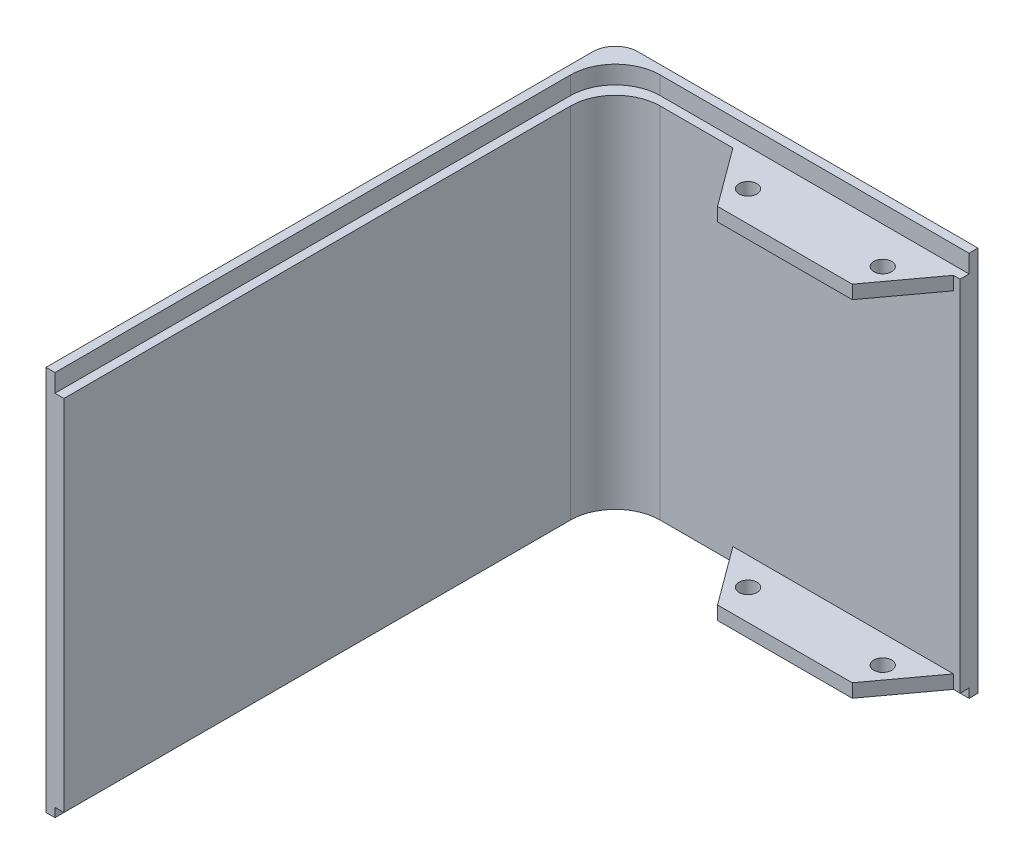
ISO-10303-21;
HEADER;
FILE_DESCRIPTION(('STEP AP214'),'2;1');
FILE_NAME('part.step','',(''),(''),'','','');
FILE_SCHEMA(('AUTOMOTIVE_DESIGN { 1 0 10303 214 1 1 1 1 }'));
ENDSEC;
DATA;
#1=APPLICATION_CONTEXT('core data for automotive mechanical design processes');
#2=APPLICATION_PROTOCOL_DEFINITION('international standard','automotive_design',2000,#1);
#3=PRODUCT_CONTEXT('',#1,'mechanical');
#4=PRODUCT('Part','Part','',(#3));
#5=PRODUCT_RELATED_PRODUCT_CATEGORY('part','',(#4));
#6=PRODUCT_DEFINITION_FORMATION('','',#4);
#7=PRODUCT_DEFINITION_CONTEXT('part definition',#1,'design');
#8=PRODUCT_DEFINITION('design','',#6,#7);
#9=PRODUCT_DEFINITION_SHAPE('','',#8);
#10=(LENGTH_UNIT() NAMED_UNIT(*) SI_UNIT(.MILLI.,.METRE.));
#11=(NAMED_UNIT(*) PLANE_ANGLE_UNIT() SI_UNIT($,.RADIAN.));
#12=(NAMED_UNIT(*) SI_UNIT($,.STERADIAN.) SOLID_ANGLE_UNIT());
#13=UNCERTAINTY_MEASURE_WITH_UNIT(LENGTH_MEASURE(1.E-05),#10,'distance_accuracy_value','');
#14=(GEOMETRIC_REPRESENTATION_CONTEXT(3) GLOBAL_UNCERTAINTY_ASSIGNED_CONTEXT((#13)) GLOBAL_UNIT_ASSIGNED_CONTEXT((#10,
#11,#12)) REPRESENTATION_CONTEXT('',''));
#15=CARTESIAN_POINT('',(0.,0.,0.));
#16=DIRECTION('',(0.,0.,1.));
#17=DIRECTION('',(1.,0.,0.));
#18=AXIS2_PLACEMENT_3D('',#15,#16,#17);
#19=CARTESIAN_POINT('',(0.,0.,-123.));
#20=DIRECTION('',(0.,0.,-1.));
#21=DIRECTION('',(1.,0.,0.));
#22=AXIS2_PLACEMENT_3D('',#19,#20,#21);
#23=PLANE('',#22);
#24=DIRECTION('',(0.,1.,0.));
#25=VECTOR('',#24,1.);
#26=CARTESIAN_POINT('',(78.4266666666667,36.,-123.));
#27=LINE('',#26,#25);
#28=CARTESIAN_POINT('',(78.4266666666667,36.,-123.));
#29=VERTEX_POINT('',#28);
#30=CARTESIAN_POINT('',(78.4266666666667,39.,-123.));
#31=VERTEX_POINT('',#30);
#32=EDGE_CURVE('E227',#29,#31,#27,.T.);
#33=ORIENTED_EDGE('',*,*,#32,.F.);
#34=DIRECTION('',(1.,0.,0.));
#35=VECTOR('',#34,1.);
#36=CARTESIAN_POINT('',(0.,36.,-123.));
#37=LINE('',#36,#35);
#38=CARTESIAN_POINT('',(29.2225760349674,36.,-123.));
#39=VERTEX_POINT('',#38);
#40=EDGE_CURVE('E214',#39,#29,#37,.T.);
#41=ORIENTED_EDGE('',*,*,#40,.F.);
#42=DIRECTION('',(0.,1.,0.));
#43=VECTOR('',#42,1.);
#44=CARTESIAN_POINT('',(29.2225760349674,36.,-123.));
#45=LINE('',#44,#43);
#46=CARTESIAN_POINT('',(29.2225760349674,39.,-123.));
#47=VERTEX_POINT('',#46);
#48=EDGE_CURVE('E212',#39,#47,#45,.T.);
#49=ORIENTED_EDGE('',*,*,#48,.T.);
#50=DIRECTION('',(1.,0.,0.));
#51=VECTOR('',#50,1.);
#52=CARTESIAN_POINT('',(-3.47213595499959,39.,-123.));
#53=LINE('',#52,#51);
#54=CARTESIAN_POINT('',(13.,39.,-123.));
#55=VERTEX_POINT('',#54);
#56=EDGE_CURVE('E279',#55,#47,#53,.T.);
#57=ORIENTED_EDGE('',*,*,#56,.F.);
#58=DIRECTION('',(0.,1.,0.));
#59=VECTOR('',#58,1.);
#60=CARTESIAN_POINT('',(13.,39.,-123.));
#61=LINE('',#60,#59);
#62=CARTESIAN_POINT('',(13.,-41.,-123.));
#63=VERTEX_POINT('',#62);
#64=EDGE_CURVE('E378',#63,#55,#61,.T.);
#65=ORIENTED_EDGE('',*,*,#64,.F.);
#66=DIRECTION('',(1.,0.,0.));
#67=VECTOR('',#66,1.);
#68=CARTESIAN_POINT('',(-3.47213595499959,-41.,-123.));
#69=LINE('',#68,#67);
#70=CARTESIAN_POINT('',(29.2225760349674,-41.,-123.));
#71=VERTEX_POINT('',#70);
#72=EDGE_CURVE('E289',#63,#71,#69,.T.);
#73=ORIENTED_EDGE('',*,*,#72,.T.);
#74=DIRECTION('',(0.,-1.,0.));
#75=VECTOR('',#74,1.);
#76=CARTESIAN_POINT('',(29.2225760349674,-38.,-123.));
#77=LINE('',#76,#75);
#78=CARTESIAN_POINT('',(29.2225760349674,-38.,-123.));
#79=VERTEX_POINT('',#78);
#80=EDGE_CURVE('E266',#79,#71,#77,.T.);
#81=ORIENTED_EDGE('',*,*,#80,.F.);
#82=DIRECTION('',(1.,0.,0.));
#83=VECTOR('',#82,1.);
#84=CARTESIAN_POINT('',(0.,-38.,-123.));
#85=LINE('',#84,#83);
#86=CARTESIAN_POINT('',(78.4266666666667,-38.,-123.));
#87=VERTEX_POINT('',#86);
#88=EDGE_CURVE('E252',#79,#87,#85,.T.);
#89=ORIENTED_EDGE('',*,*,#88,.T.);
#90=DIRECTION('',(0.,-1.,0.));
#91=VECTOR('',#90,1.);
#92=CARTESIAN_POINT('',(78.4266666666667,-38.,-123.));
#93=LINE('',#92,#91);
#94=CARTESIAN_POINT('',(78.4266666666667,-41.,-123.));
#95=VERTEX_POINT('',#94);
#96=EDGE_CURVE('E269',#87,#95,#93,.T.);
#97=ORIENTED_EDGE('',*,*,#96,.T.);
#98=CARTESIAN_POINT('',(79.9,-41.,-123.));
#99=VERTEX_POINT('',#98);
#100=EDGE_CURVE('E265',#95,#99,#69,.T.);
#101=ORIENTED_EDGE('',*,*,#100,.T.);
#102=DIRECTION('',(0.,1.,0.));
#103=VECTOR('',#102,1.);
#104=CARTESIAN_POINT('',(79.9,-42.9999999999999,-123.));
#105=LINE('',#104,#103);
#106=CARTESIAN_POINT('',(79.9,39.,-123.));
#107=VERTEX_POINT('',#106);
#108=EDGE_CURVE('E282',#99,#107,#105,.T.);
#109=ORIENTED_EDGE('',*,*,#108,.T.);
#110=EDGE_CURVE('E283',#31,#107,#53,.T.);
#111=ORIENTED_EDGE('',*,*,#110,.F.);
#112=EDGE_LOOP('',(#33,#41,#49,#57,#65,#73,#81,#89,#97,#101,#109,#111));
#113=FACE_BOUND('',#112,.T.);
#114=ADVANCED_FACE('F47',(#113),#23,.F.);
#115=CARTESIAN_POINT('',(-0.999999999999999,43.,-123.));
#116=DIRECTION('',(0.,-1.,0.));
#117=DIRECTION('',(0.,0.,1.));
#118=AXIS2_PLACEMENT_3D('',#115,#116,#117);
#119=PLANE('',#118);
#120=DIRECTION('',(0.,0.,1.));
#121=VECTOR('',#120,1.);
#122=CARTESIAN_POINT('',(-0.999999999999999,43.,-123.));
#123=LINE('',#122,#121);
#124=CARTESIAN_POINT('',(-0.999999999999999,43.,-122.));
#125=VERTEX_POINT('',#124);
#126=CARTESIAN_POINT('',(-0.999999999999999,43.,0.));
#127=VERTEX_POINT('',#126);
#128=EDGE_CURVE('E362',#125,#127,#123,.T.);
#129=ORIENTED_EDGE('',*,*,#128,.T.);
#130=DIRECTION('',(-1.,0.,0.));
#131=VECTOR('',#130,1.);
#132=CARTESIAN_POINT('',(-0.999999999999999,43.,0.));
#133=LINE('',#132,#131);
#134=CARTESIAN_POINT('',(1.,43.,0.));
#135=VERTEX_POINT('',#134);
#136=EDGE_CURVE('E318',#135,#127,#133,.T.);
#137=ORIENTED_EDGE('',*,*,#136,.F.);
#138=DIRECTION('',(0.,0.,1.));
#139=VECTOR('',#138,1.);
#140=CARTESIAN_POINT('',(1.,43.,-123.));
#141=LINE('',#140,#139);
#142=CARTESIAN_POINT('',(1.,43.,-115.));
#143=VERTEX_POINT('',#142);
#144=EDGE_CURVE('E341',#143,#135,#141,.T.);
#145=ORIENTED_EDGE('',*,*,#144,.F.);
#146=CARTESIAN_POINT('',(11.,43.,-115.));
#147=DIRECTION('',(0.,1.,0.));
#148=DIRECTION('',(0.,0.,1.));
#149=AXIS2_PLACEMENT_3D('',#146,#147,#148);
#150=CIRCLE('',#149,10.);
#151=CARTESIAN_POINT('',(11.,43.,-125.));
#152=VERTEX_POINT('',#151);
#153=EDGE_CURVE('E394',#152,#143,#150,.T.);
#154=ORIENTED_EDGE('',*,*,#153,.F.);
#155=DIRECTION('',(1.,0.,0.));
#156=VECTOR('',#155,1.);
#157=CARTESIAN_POINT('',(-3.47213595499959,43.,-125.));
#158=LINE('',#157,#156);
#159=CARTESIAN_POINT('',(79.9,43.,-125.));
#160=VERTEX_POINT('',#159);
#161=EDGE_CURVE('E275',#152,#160,#158,.T.);
#162=ORIENTED_EDGE('',*,*,#161,.T.);
#163=DIRECTION('',(0.,0.,1.));
#164=VECTOR('',#163,1.);
#165=CARTESIAN_POINT('',(79.9,43.,-127.));
#166=LINE('',#165,#164);
#167=CARTESIAN_POINT('',(79.9,43.,-127.));
#168=VERTEX_POINT('',#167);
#169=EDGE_CURVE('E310',#168,#160,#166,.T.);
#170=ORIENTED_EDGE('',*,*,#169,.F.);
#171=DIRECTION('',(-1.,0.,0.));
#172=VECTOR('',#171,1.);
#173=CARTESIAN_POINT('',(79.9,43.,-127.));
#174=LINE('',#173,#172);
#175=CARTESIAN_POINT('',(4.,43.,-127.));
#176=VERTEX_POINT('',#175);
#177=EDGE_CURVE('E307',#168,#176,#174,.T.);
#178=ORIENTED_EDGE('',*,*,#177,.T.);
#179=CARTESIAN_POINT('',(4.,43.,-122.));
#180=DIRECTION('',(0.,1.,0.));
#181=DIRECTION('',(0.,0.,1.));
#182=AXIS2_PLACEMENT_3D('',#179,#180,#181);
#183=CIRCLE('',#182,5.);
#184=EDGE_CURVE('E371',#125,#176,#183,.F.);
#185=ORIENTED_EDGE('',*,*,#184,.F.);
#186=EDGE_LOOP('',(#129,#137,#145,#154,#162,#170,#178,#185));
#187=FACE_BOUND('',#186,.T.);
#188=ADVANCED_FACE('F464',(#187),#119,.F.);
#189=CARTESIAN_POINT('',(-0.999999999999999,-43.,-123.));
#190=DIRECTION('',(1.,0.,0.));
#191=DIRECTION('',(0.,0.,1.));
#192=AXIS2_PLACEMENT_3D('',#189,#190,#191);
#193=PLANE('',#192);
#194=DIRECTION('',(0.,0.,1.));
#195=VECTOR('',#194,1.);
#196=CARTESIAN_POINT('',(-0.999999999999999,-43.,-123.));
#197=LINE('',#196,#195);
#198=CARTESIAN_POINT('',(-0.999999999999999,-43.,-122.));
#199=VERTEX_POINT('',#198);
#200=CARTESIAN_POINT('',(-0.999999999999999,-43.,0.));
#201=VERTEX_POINT('',#200);
#202=EDGE_CURVE('E359',#199,#201,#197,.T.);
#203=ORIENTED_EDGE('',*,*,#202,.T.);
#204=DIRECTION('',(0.,-1.,0.));
#205=VECTOR('',#204,1.);
#206=CARTESIAN_POINT('',(-0.999999999999999,-43.,0.));
#207=LINE('',#206,#205);
#208=EDGE_CURVE('E321',#127,#201,#207,.T.);
#209=ORIENTED_EDGE('',*,*,#208,.F.);
#210=ORIENTED_EDGE('',*,*,#128,.F.);
#211=DIRECTION('',(0.,-1.,0.));
#212=VECTOR('',#211,1.);
#213=CARTESIAN_POINT('',(-0.999999999999999,43.,-122.));
#214=LINE('',#213,#212);
#215=EDGE_CURVE('E369',#199,#125,#214,.F.);
#216=ORIENTED_EDGE('',*,*,#215,.F.);
#217=EDGE_LOOP('',(#203,#209,#210,#216));
#218=FACE_BOUND('',#217,.T.);
#219=ADVANCED_FACE('F469',(#218),#193,.F.);
#220=CARTESIAN_POINT('',(-0.999999999999999,-43.,-123.));
#221=DIRECTION('',(0.,1.,0.));
#222=DIRECTION('',(0.,0.,-1.));
#223=AXIS2_PLACEMENT_3D('',#220,#221,#222);
#224=PLANE('',#223);
#225=DIRECTION('',(1.,0.,0.));
#226=VECTOR('',#225,1.);
#227=CARTESIAN_POINT('',(79.9,-42.9999999999999,-127.));
#228=LINE('',#227,#226);
#229=CARTESIAN_POINT('',(4.,-43.,-127.));
#230=VERTEX_POINT('',#229);
#231=CARTESIAN_POINT('',(79.9,-42.9999999999999,-127.));
#232=VERTEX_POINT('',#231);
#233=EDGE_CURVE('E302',#230,#232,#228,.T.);
#234=ORIENTED_EDGE('',*,*,#233,.T.);
#235=DIRECTION('',(0.,0.,1.));
#236=VECTOR('',#235,1.);
#237=CARTESIAN_POINT('',(79.9,-42.9999999999999,-127.));
#238=LINE('',#237,#236);
#239=CARTESIAN_POINT('',(79.9,-43.,-125.));
#240=VERTEX_POINT('',#239);
#241=EDGE_CURVE('E315',#232,#240,#238,.T.);
#242=ORIENTED_EDGE('',*,*,#241,.T.);
#243=DIRECTION('',(1.,0.,0.));
#244=VECTOR('',#243,1.);
#245=CARTESIAN_POINT('',(-3.47213595499959,-43.,-125.));
#246=LINE('',#245,#244);
#247=CARTESIAN_POINT('',(11.,-43.,-125.));
#248=VERTEX_POINT('',#247);
#249=EDGE_CURVE('E292',#248,#240,#246,.T.);
#250=ORIENTED_EDGE('',*,*,#249,.F.);
#251=CARTESIAN_POINT('',(11.,-43.,-115.));
#252=DIRECTION('',(0.,-1.,0.));
#253=DIRECTION('',(0.,0.,-1.));
#254=AXIS2_PLACEMENT_3D('',#251,#252,#253);
#255=CIRCLE('',#254,10.);
#256=CARTESIAN_POINT('',(1.,-43.,-115.));
#257=VERTEX_POINT('',#256);
#258=EDGE_CURVE('E387',#257,#248,#255,.T.);
#259=ORIENTED_EDGE('',*,*,#258,.F.);
#260=DIRECTION('',(0.,0.,1.));
#261=VECTOR('',#260,1.);
#262=CARTESIAN_POINT('',(1.,-43.,-123.));
#263=LINE('',#262,#261);
#264=CARTESIAN_POINT('',(1.,-43.,0.));
#265=VERTEX_POINT('',#264);
#266=EDGE_CURVE('E356',#257,#265,#263,.T.);
#267=ORIENTED_EDGE('',*,*,#266,.T.);
#268=DIRECTION('',(1.,0.,0.));
#269=VECTOR('',#268,1.);
#270=CARTESIAN_POINT('',(-0.999999999999999,-43.,0.));
#271=LINE('',#270,#269);
#272=EDGE_CURVE('E324',#201,#265,#271,.T.);
#273=ORIENTED_EDGE('',*,*,#272,.F.);
#274=ORIENTED_EDGE('',*,*,#202,.F.);
#275=CARTESIAN_POINT('',(4.,-43.,-122.));
#276=DIRECTION('',(0.,-1.,0.));
#277=DIRECTION('',(0.,0.,-1.));
#278=AXIS2_PLACEMENT_3D('',#275,#276,#277);
#279=CIRCLE('',#278,5.);
#280=EDGE_CURVE('E367',#230,#199,#279,.F.);
#281=ORIENTED_EDGE('',*,*,#280,.F.);
#282=EDGE_LOOP('',(#234,#242,#250,#259,#267,#273,#274,#281));
#283=FACE_BOUND('',#282,.T.);
#284=ADVANCED_FACE('F414',(#283),#224,.F.);
#285=CARTESIAN_POINT('',(1.,-43.,-123.));
#286=DIRECTION('',(-1.,0.,0.));
#287=DIRECTION('',(0.,-1.,0.));
#288=AXIS2_PLACEMENT_3D('',#285,#286,#287);
#289=PLANE('',#288);
#290=DIRECTION('',(0.,0.,1.));
#291=VECTOR('',#290,1.);
#292=CARTESIAN_POINT('',(1.,-41.,-123.));
#293=LINE('',#292,#291);
#294=CARTESIAN_POINT('',(1.,-41.,-115.));
#295=VERTEX_POINT('',#294);
#296=CARTESIAN_POINT('',(1.,-41.,0.));
#297=VERTEX_POINT('',#296);
#298=EDGE_CURVE('E353',#295,#297,#293,.T.);
#299=ORIENTED_EDGE('',*,*,#298,.T.);
#300=DIRECTION('',(0.,1.,0.));
#301=VECTOR('',#300,1.);
#302=CARTESIAN_POINT('',(1.,-43.,0.));
#303=LINE('',#302,#301);
#304=EDGE_CURVE('E327',#265,#297,#303,.T.);
#305=ORIENTED_EDGE('',*,*,#304,.F.);
#306=ORIENTED_EDGE('',*,*,#266,.F.);
#307=DIRECTION('',(0.,-1.,0.));
#308=VECTOR('',#307,1.);
#309=CARTESIAN_POINT('',(1.,-43.,-115.));
#310=LINE('',#309,#308);
#311=EDGE_CURVE('E374',#295,#257,#310,.T.);
#312=ORIENTED_EDGE('',*,*,#311,.F.);
#313=EDGE_LOOP('',(#299,#305,#306,#312));
#314=FACE_BOUND('',#313,.T.);
#315=ADVANCED_FACE('F405',(#314),#289,.F.);
#316=CARTESIAN_POINT('',(3.,-41.,-123.));
#317=DIRECTION('',(0.,1.,0.));
#318=DIRECTION('',(0.,0.,-1.));
#319=AXIS2_PLACEMENT_3D('',#316,#317,#318);
#320=PLANE('',#319);
#321=CARTESIAN_POINT('',(38.8,-41.,-116.8));
#322=DIRECTION('',(0.,-1.,0.));
#323=DIRECTION('',(0.,0.,-1.));
#324=AXIS2_PLACEMENT_3D('',#321,#322,#323);
#325=CIRCLE('',#324,2.);
#326=CARTESIAN_POINT('',(38.8,-41.,-118.8));
#327=VERTEX_POINT('',#326);
#328=EDGE_CURVE('E232',#327,#327,#325,.T.);
#329=ORIENTED_EDGE('',*,*,#328,.F.);
#330=EDGE_LOOP('',(#329));
#331=FACE_BOUND('',#330,.T.);
#332=CARTESIAN_POINT('',(68.85,-41.,-116.8));
#333=DIRECTION('',(0.,-1.,0.));
#334=DIRECTION('',(0.,0.,-1.));
#335=AXIS2_PLACEMENT_3D('',#332,#333,#334);
#336=CIRCLE('',#335,2.);
#337=CARTESIAN_POINT('',(68.85,-41.,-118.8));
#338=VERTEX_POINT('',#337);
#339=EDGE_CURVE('E242',#338,#338,#336,.T.);
#340=ORIENTED_EDGE('',*,*,#339,.F.);
#341=EDGE_LOOP('',(#340));
#342=FACE_BOUND('',#341,.T.);
#343=DIRECTION('',(1.,0.,0.));
#344=VECTOR('',#343,1.);
#345=CARTESIAN_POINT('',(-3.47213595499959,-41.,-125.));
#346=LINE('',#345,#344);
#347=CARTESIAN_POINT('',(11.,-41.,-125.));
#348=VERTEX_POINT('',#347);
#349=CARTESIAN_POINT('',(79.9,-41.,-125.));
#350=VERTEX_POINT('',#349);
#351=EDGE_CURVE('E293',#348,#350,#346,.T.);
#352=ORIENTED_EDGE('',*,*,#351,.T.);
#353=DIRECTION('',(0.,0.,-1.));
#354=VECTOR('',#353,1.);
#355=CARTESIAN_POINT('',(79.9,-41.,-125.));
#356=LINE('',#355,#354);
#357=EDGE_CURVE('E278',#99,#350,#356,.T.);
#358=ORIENTED_EDGE('',*,*,#357,.F.);
#359=ORIENTED_EDGE('',*,*,#100,.F.);
#360=DIRECTION('',(0.593107488179526,0.,-0.805123287121528));
#361=VECTOR('',#360,1.);
#362=CARTESIAN_POINT('',(-7.89752306595316,-41.,-5.81784199191883));
#363=LINE('',#362,#361);
#364=CARTESIAN_POINT('',(68.85,-41.,-110.));
#365=VERTEX_POINT('',#364);
#366=EDGE_CURVE('E260',#365,#95,#363,.T.);
#367=ORIENTED_EDGE('',*,*,#366,.F.);
#368=DIRECTION('',(1.,0.,0.));
#369=VECTOR('',#368,1.);
#370=CARTESIAN_POINT('',(0.,-41.,-110.));
#371=LINE('',#370,#369);
#372=CARTESIAN_POINT('',(38.8,-41.,-110.));
#373=VERTEX_POINT('',#372);
#374=EDGE_CURVE('E235',#373,#365,#371,.T.);
#375=ORIENTED_EDGE('',*,*,#374,.F.);
#376=DIRECTION('',(-0.593137889518411,0.,-0.805100890583066));
#377=VECTOR('',#376,1.);
#378=CARTESIAN_POINT('',(77.6786155677662,-41.,-57.2277718699445));
#379=LINE('',#378,#377);
#380=EDGE_CURVE('E250',#373,#71,#379,.T.);
#381=ORIENTED_EDGE('',*,*,#380,.T.);
#382=ORIENTED_EDGE('',*,*,#72,.F.);
#383=CARTESIAN_POINT('',(13.,-41.,-113.));
#384=DIRECTION('',(0.,-1.,0.));
#385=DIRECTION('',(0.,0.,-1.));
#386=AXIS2_PLACEMENT_3D('',#383,#384,#385);
#387=CIRCLE('',#386,10.);
#388=CARTESIAN_POINT('',(3.,-41.,-113.));
#389=VERTEX_POINT('',#388);
#390=EDGE_CURVE('E392',#389,#63,#387,.T.);
#391=ORIENTED_EDGE('',*,*,#390,.F.);
#392=DIRECTION('',(0.,0.,1.));
#393=VECTOR('',#392,1.);
#394=CARTESIAN_POINT('',(3.,-41.,-123.));
#395=LINE('',#394,#393);
#396=CARTESIAN_POINT('',(3.,-41.,0.));
#397=VERTEX_POINT('',#396);
#398=EDGE_CURVE('E350',#389,#397,#395,.T.);
#399=ORIENTED_EDGE('',*,*,#398,.T.);
#400=DIRECTION('',(1.,0.,0.));
#401=VECTOR('',#400,1.);
#402=CARTESIAN_POINT('',(3.,-41.,0.));
#403=LINE('',#402,#401);
#404=EDGE_CURVE('E330',#297,#397,#403,.T.);
#405=ORIENTED_EDGE('',*,*,#404,.F.);
#406=ORIENTED_EDGE('',*,*,#298,.F.);
#407=CARTESIAN_POINT('',(11.,-41.,-115.));
#408=DIRECTION('',(0.,-1.,0.));
#409=DIRECTION('',(0.,0.,-1.));
#410=AXIS2_PLACEMENT_3D('',#407,#408,#409);
#411=CIRCLE('',#410,10.);
#412=EDGE_CURVE('E55',#348,#295,#411,.F.);
#413=ORIENTED_EDGE('',*,*,#412,.F.);
#414=EDGE_LOOP('',(#352,#358,#359,#367,#375,#381,#382,#391,#399,#405,#406,#413));
#415=FACE_BOUND('',#414,.T.);
#416=ADVANCED_FACE('F407',(#331,#342,#415),#320,.F.);
#417=CARTESIAN_POINT('',(3.,-41.,-123.));
#418=DIRECTION('',(-1.,0.,0.));
#419=DIRECTION('',(0.,-1.,0.));
#420=AXIS2_PLACEMENT_3D('',#417,#418,#419);
#421=PLANE('',#420);
#422=DIRECTION('',(0.,0.,1.));
#423=VECTOR('',#422,1.);
#424=CARTESIAN_POINT('',(3.,39.,-123.));
#425=LINE('',#424,#423);
#426=CARTESIAN_POINT('',(3.,39.,-113.));
#427=VERTEX_POINT('',#426);
#428=CARTESIAN_POINT('',(3.,39.,0.));
#429=VERTEX_POINT('',#428);
#430=EDGE_CURVE('E347',#427,#429,#425,.T.);
#431=ORIENTED_EDGE('',*,*,#430,.T.);
#432=DIRECTION('',(0.,1.,0.));
#433=VECTOR('',#432,1.);
#434=CARTESIAN_POINT('',(3.,-41.,0.));
#435=LINE('',#434,#433);
#436=EDGE_CURVE('E333',#397,#429,#435,.T.);
#437=ORIENTED_EDGE('',*,*,#436,.F.);
#438=ORIENTED_EDGE('',*,*,#398,.F.);
#439=DIRECTION('',(0.,1.,0.));
#440=VECTOR('',#439,1.);
#441=CARTESIAN_POINT('',(3.,-41.,-113.));
#442=LINE('',#441,#440);
#443=EDGE_CURVE('E381',#427,#389,#442,.F.);
#444=ORIENTED_EDGE('',*,*,#443,.F.);
#445=EDGE_LOOP('',(#431,#437,#438,#444));
#446=FACE_BOUND('',#445,.T.);
#447=ADVANCED_FACE('F452',(#446),#421,.F.);
#448=CARTESIAN_POINT('',(3.,39.,-123.));
#449=DIRECTION('',(0.,-1.,0.));
#450=DIRECTION('',(0.,0.,1.));
#451=AXIS2_PLACEMENT_3D('',#448,#449,#450);
#452=PLANE('',#451);
#453=CARTESIAN_POINT('',(38.8,39.,-116.8));
#454=DIRECTION('',(0.,-1.,0.));
#455=DIRECTION('',(0.,0.,-1.));
#456=AXIS2_PLACEMENT_3D('',#453,#454,#455);
#457=CIRCLE('',#456,2.);
#458=CARTESIAN_POINT('',(38.8,39.,-118.8));
#459=VERTEX_POINT('',#458);
#460=EDGE_CURVE('E487',#459,#459,#457,.T.);
#461=ORIENTED_EDGE('',*,*,#460,.T.);
#462=EDGE_LOOP('',(#461));
#463=FACE_BOUND('',#462,.T.);
#464=CARTESIAN_POINT('',(68.85,39.,-116.8));
#465=DIRECTION('',(0.,-1.,0.));
#466=DIRECTION('',(0.,0.,-1.));
#467=AXIS2_PLACEMENT_3D('',#464,#465,#466);
#468=CIRCLE('',#467,2.);
#469=CARTESIAN_POINT('',(68.85,39.,-118.8));
#470=VERTEX_POINT('',#469);
#471=EDGE_CURVE('E493',#470,#470,#468,.T.);
#472=ORIENTED_EDGE('',*,*,#471,.T.);
#473=EDGE_LOOP('',(#472));
#474=FACE_BOUND('',#473,.T.);
#475=DIRECTION('',(0.,0.,1.));
#476=VECTOR('',#475,1.);
#477=CARTESIAN_POINT('',(1.,39.,-123.));
#478=LINE('',#477,#476);
#479=CARTESIAN_POINT('',(1.,39.,-115.));
#480=VERTEX_POINT('',#479);
#481=CARTESIAN_POINT('',(1.,39.,0.));
#482=VERTEX_POINT('',#481);
#483=EDGE_CURVE('E344',#480,#482,#478,.T.);
#484=ORIENTED_EDGE('',*,*,#483,.T.);
#485=DIRECTION('',(-1.,0.,0.));
#486=VECTOR('',#485,1.);
#487=CARTESIAN_POINT('',(3.,39.,0.));
#488=LINE('',#487,#486);
#489=EDGE_CURVE('E336',#429,#482,#488,.T.);
#490=ORIENTED_EDGE('',*,*,#489,.F.);
#491=ORIENTED_EDGE('',*,*,#430,.F.);
#492=CARTESIAN_POINT('',(13.,39.,-113.));
#493=DIRECTION('',(0.,1.,0.));
#494=DIRECTION('',(0.,0.,1.));
#495=AXIS2_PLACEMENT_3D('',#492,#493,#494);
#496=CIRCLE('',#495,10.);
#497=EDGE_CURVE('E390',#55,#427,#496,.T.);
#498=ORIENTED_EDGE('',*,*,#497,.F.);
#499=ORIENTED_EDGE('',*,*,#56,.T.);
#500=DIRECTION('',(-0.593137889518411,0.,-0.805100890583066));
#501=VECTOR('',#500,1.);
#502=CARTESIAN_POINT('',(77.6786155677662,39.,-57.2277718699445));
#503=LINE('',#502,#501);
#504=CARTESIAN_POINT('',(38.8,39.,-110.));
#505=VERTEX_POINT('',#504);
#506=EDGE_CURVE('E485',#505,#47,#503,.T.);
#507=ORIENTED_EDGE('',*,*,#506,.F.);
#508=DIRECTION('',(1.,0.,0.));
#509=VECTOR('',#508,1.);
#510=CARTESIAN_POINT('',(0.,39.,-110.));
#511=LINE('',#510,#509);
#512=CARTESIAN_POINT('',(68.85,39.,-110.));
#513=VERTEX_POINT('',#512);
#514=EDGE_CURVE('E224',#505,#513,#511,.T.);
#515=ORIENTED_EDGE('',*,*,#514,.T.);
#516=DIRECTION('',(0.593107488179526,0.,-0.805123287121528));
#517=VECTOR('',#516,1.);
#518=CARTESIAN_POINT('',(-7.89752306595316,39.,-5.81784199191883));
#519=LINE('',#518,#517);
#520=EDGE_CURVE('E220',#513,#31,#519,.T.);
#521=ORIENTED_EDGE('',*,*,#520,.T.);
#522=ORIENTED_EDGE('',*,*,#110,.T.);
#523=DIRECTION('',(0.,0.,1.));
#524=VECTOR('',#523,1.);
#525=CARTESIAN_POINT('',(79.9,39.,-125.));
#526=LINE('',#525,#524);
#527=CARTESIAN_POINT('',(79.9,39.,-125.));
#528=VERTEX_POINT('',#527);
#529=EDGE_CURVE('E273',#528,#107,#526,.T.);
#530=ORIENTED_EDGE('',*,*,#529,.F.);
#531=DIRECTION('',(1.,0.,0.));
#532=VECTOR('',#531,1.);
#533=CARTESIAN_POINT('',(-3.47213595499959,39.,-125.));
#534=LINE('',#533,#532);
#535=CARTESIAN_POINT('',(11.,39.,-125.));
#536=VERTEX_POINT('',#535);
#537=EDGE_CURVE('E284',#536,#528,#534,.T.);
#538=ORIENTED_EDGE('',*,*,#537,.F.);
#539=CARTESIAN_POINT('',(11.,39.,-115.));
#540=DIRECTION('',(0.,1.,0.));
#541=DIRECTION('',(0.,0.,1.));
#542=AXIS2_PLACEMENT_3D('',#539,#540,#541);
#543=CIRCLE('',#542,10.);
#544=EDGE_CURVE('E11',#480,#536,#543,.F.);
#545=ORIENTED_EDGE('',*,*,#544,.F.);
#546=EDGE_LOOP('',(#484,#490,#491,#498,#499,#507,#515,#521,#522,#530,#538,#545));
#547=FACE_BOUND('',#546,.T.);
#548=ADVANCED_FACE('F456',(#463,#474,#547),#452,.F.);
#549=CARTESIAN_POINT('',(1.,39.,-123.));
#550=DIRECTION('',(-1.,0.,0.));
#551=DIRECTION('',(0.,-1.,0.));
#552=AXIS2_PLACEMENT_3D('',#549,#550,#551);
#553=PLANE('',#552);
#554=ORIENTED_EDGE('',*,*,#144,.T.);
#555=DIRECTION('',(0.,1.,0.));
#556=VECTOR('',#555,1.);
#557=CARTESIAN_POINT('',(1.,39.,0.));
#558=LINE('',#557,#556);
#559=EDGE_CURVE('E339',#482,#135,#558,.T.);
#560=ORIENTED_EDGE('',*,*,#559,.F.);
#561=ORIENTED_EDGE('',*,*,#483,.F.);
#562=DIRECTION('',(0.,-1.,0.));
#563=VECTOR('',#562,1.);
#564=CARTESIAN_POINT('',(1.,39.,-115.));
#565=LINE('',#564,#563);
#566=EDGE_CURVE('E383',#143,#480,#565,.T.);
#567=ORIENTED_EDGE('',*,*,#566,.F.);
#568=EDGE_LOOP('',(#554,#560,#561,#567));
#569=FACE_BOUND('',#568,.T.);
#570=ADVANCED_FACE('F459',(#569),#553,.F.);
#571=CARTESIAN_POINT('',(0.,0.,0.));
#572=DIRECTION('',(0.,0.,-1.));
#573=DIRECTION('',(1.,0.,0.));
#574=AXIS2_PLACEMENT_3D('',#571,#572,#573);
#575=PLANE('',#574);
#576=ORIENTED_EDGE('',*,*,#136,.T.);
#577=ORIENTED_EDGE('',*,*,#208,.T.);
#578=ORIENTED_EDGE('',*,*,#272,.T.);
#579=ORIENTED_EDGE('',*,*,#304,.T.);
#580=ORIENTED_EDGE('',*,*,#404,.T.);
#581=ORIENTED_EDGE('',*,*,#436,.T.);
#582=ORIENTED_EDGE('',*,*,#489,.T.);
#583=ORIENTED_EDGE('',*,*,#559,.T.);
#584=EDGE_LOOP('',(#576,#577,#578,#579,#580,#581,#582,#583));
#585=FACE_BOUND('',#584,.T.);
#586=ADVANCED_FACE('F411',(#585),#575,.F.);
#587=CARTESIAN_POINT('',(79.9,-42.9999999999999,-127.));
#588=DIRECTION('',(-1.,0.,0.));
#589=DIRECTION('',(0.,0.,-1.));
#590=AXIS2_PLACEMENT_3D('',#587,#588,#589);
#591=PLANE('',#590);
#592=ORIENTED_EDGE('',*,*,#529,.T.);
#593=ORIENTED_EDGE('',*,*,#108,.F.);
#594=ORIENTED_EDGE('',*,*,#357,.T.);
#595=DIRECTION('',(0.,-1.,0.));
#596=VECTOR('',#595,1.);
#597=CARTESIAN_POINT('',(79.9,-43.,-125.));
#598=LINE('',#597,#596);
#599=EDGE_CURVE('E296',#350,#240,#598,.T.);
#600=ORIENTED_EDGE('',*,*,#599,.T.);
#601=ORIENTED_EDGE('',*,*,#241,.F.);
#602=DIRECTION('',(0.,1.,0.));
#603=VECTOR('',#602,1.);
#604=CARTESIAN_POINT('',(79.9,-42.9999999999999,-127.));
#605=LINE('',#604,#603);
#606=EDGE_CURVE('E305',#232,#168,#605,.T.);
#607=ORIENTED_EDGE('',*,*,#606,.T.);
#608=ORIENTED_EDGE('',*,*,#169,.T.);
#609=DIRECTION('',(0.,-1.,0.));
#610=VECTOR('',#609,1.);
#611=CARTESIAN_POINT('',(79.9,39.,-125.));
#612=LINE('',#611,#610);
#613=EDGE_CURVE('E276',#160,#528,#612,.T.);
#614=ORIENTED_EDGE('',*,*,#613,.T.);
#615=EDGE_LOOP('',(#592,#593,#594,#600,#601,#607,#608,#614));
#616=FACE_BOUND('',#615,.T.);
#617=ADVANCED_FACE('F424',(#616),#591,.F.);
#618=CARTESIAN_POINT('',(0.,0.,-127.));
#619=DIRECTION('',(0.,0.,-1.));
#620=DIRECTION('',(1.,0.,0.));
#621=AXIS2_PLACEMENT_3D('',#618,#619,#620);
#622=PLANE('',#621);
#623=ORIENTED_EDGE('',*,*,#177,.F.);
#624=ORIENTED_EDGE('',*,*,#606,.F.);
#625=ORIENTED_EDGE('',*,*,#233,.F.);
#626=DIRECTION('',(0.,-1.,0.));
#627=VECTOR('',#626,1.);
#628=CARTESIAN_POINT('',(4.,-43.,-127.));
#629=LINE('',#628,#627);
#630=EDGE_CURVE('E365',#176,#230,#629,.T.);
#631=ORIENTED_EDGE('',*,*,#630,.F.);
#632=EDGE_LOOP('',(#623,#624,#625,#631));
#633=FACE_BOUND('',#632,.T.);
#634=ADVANCED_FACE('F475',(#633),#622,.T.);
#635=CARTESIAN_POINT('',(-3.47213595499959,-43.,-125.));
#636=DIRECTION('',(0.,0.,-1.));
#637=DIRECTION('',(1.,0.,0.));
#638=AXIS2_PLACEMENT_3D('',#635,#636,#637);
#639=PLANE('',#638);
#640=ORIENTED_EDGE('',*,*,#249,.T.);
#641=ORIENTED_EDGE('',*,*,#599,.F.);
#642=ORIENTED_EDGE('',*,*,#351,.F.);
#643=DIRECTION('',(0.,-1.,0.));
#644=VECTOR('',#643,1.);
#645=CARTESIAN_POINT('',(11.,-41.,-125.));
#646=LINE('',#645,#644);
#647=EDGE_CURVE('E376',#248,#348,#646,.F.);
#648=ORIENTED_EDGE('',*,*,#647,.F.);
#649=EDGE_LOOP('',(#640,#641,#642,#648));
#650=FACE_BOUND('',#649,.T.);
#651=ADVANCED_FACE('F418',(#650),#639,.F.);
#652=CARTESIAN_POINT('',(-3.47213595499959,39.,-125.));
#653=DIRECTION('',(0.,0.,-1.));
#654=DIRECTION('',(1.,0.,0.));
#655=AXIS2_PLACEMENT_3D('',#652,#653,#654);
#656=PLANE('',#655);
#657=ORIENTED_EDGE('',*,*,#537,.T.);
#658=ORIENTED_EDGE('',*,*,#613,.F.);
#659=ORIENTED_EDGE('',*,*,#161,.F.);
#660=DIRECTION('',(0.,-1.,0.));
#661=VECTOR('',#660,1.);
#662=CARTESIAN_POINT('',(11.,43.,-125.));
#663=LINE('',#662,#661);
#664=EDGE_CURVE('E385',#536,#152,#663,.F.);
#665=ORIENTED_EDGE('',*,*,#664,.F.);
#666=EDGE_LOOP('',(#657,#658,#659,#665));
#667=FACE_BOUND('',#666,.T.);
#668=ADVANCED_FACE('F479',(#667),#656,.F.);
#669=CARTESIAN_POINT('',(4.,0.,-122.));
#670=DIRECTION('',(0.,1.,0.));
#671=DIRECTION('',(0.,0.,-1.));
#672=AXIS2_PLACEMENT_3D('',#669,#670,#671);
#673=CYLINDRICAL_SURFACE('',#672,5.);
#674=ORIENTED_EDGE('',*,*,#184,.T.);
#675=ORIENTED_EDGE('',*,*,#630,.T.);
#676=ORIENTED_EDGE('',*,*,#280,.T.);
#677=ORIENTED_EDGE('',*,*,#215,.T.);
#678=EDGE_LOOP('',(#674,#675,#676,#677));
#679=FACE_BOUND('',#678,.T.);
#680=ADVANCED_FACE('F550',(#679),#673,.T.);
#681=CARTESIAN_POINT('',(11.,-43.,-115.));
#682=DIRECTION('',(0.,1.,0.));
#683=DIRECTION('',(-1.,0.,0.));
#684=AXIS2_PLACEMENT_3D('',#681,#682,#683);
#685=CYLINDRICAL_SURFACE('',#684,10.);
#686=ORIENTED_EDGE('',*,*,#412,.T.);
#687=ORIENTED_EDGE('',*,*,#311,.T.);
#688=ORIENTED_EDGE('',*,*,#258,.T.);
#689=ORIENTED_EDGE('',*,*,#647,.T.);
#690=EDGE_LOOP('',(#686,#687,#688,#689));
#691=FACE_BOUND('',#690,.T.);
#692=ADVANCED_FACE('F399',(#691),#685,.F.);
#693=CARTESIAN_POINT('',(13.,0.,-113.));
#694=DIRECTION('',(0.,-1.,0.));
#695=DIRECTION('',(1.,0.,0.));
#696=AXIS2_PLACEMENT_3D('',#693,#694,#695);
#697=CYLINDRICAL_SURFACE('',#696,10.);
#698=ORIENTED_EDGE('',*,*,#390,.T.);
#699=ORIENTED_EDGE('',*,*,#64,.T.);
#700=ORIENTED_EDGE('',*,*,#497,.T.);
#701=ORIENTED_EDGE('',*,*,#443,.T.);
#702=EDGE_LOOP('',(#698,#699,#700,#701));
#703=FACE_BOUND('',#702,.T.);
#704=ADVANCED_FACE('F448',(#703),#697,.F.);
#705=CARTESIAN_POINT('',(11.,39.,-115.));
#706=DIRECTION('',(0.,1.,0.));
#707=DIRECTION('',(-1.,0.,0.));
#708=AXIS2_PLACEMENT_3D('',#705,#706,#707);
#709=CYLINDRICAL_SURFACE('',#708,10.);
#710=ORIENTED_EDGE('',*,*,#153,.T.);
#711=ORIENTED_EDGE('',*,*,#566,.T.);
#712=ORIENTED_EDGE('',*,*,#544,.T.);
#713=ORIENTED_EDGE('',*,*,#664,.T.);
#714=EDGE_LOOP('',(#710,#711,#712,#713));
#715=FACE_BOUND('',#714,.T.);
#716=ADVANCED_FACE('F49',(#715),#709,.F.);
#717=CARTESIAN_POINT('',(0.,-38.,-110.));
#718=DIRECTION('',(0.,0.,1.));
#719=DIRECTION('',(-1.,0.,0.));
#720=AXIS2_PLACEMENT_3D('',#717,#718,#719);
#721=PLANE('',#720);
#722=ORIENTED_EDGE('',*,*,#374,.T.);
#723=DIRECTION('',(0.,-1.,0.));
#724=VECTOR('',#723,1.);
#725=CARTESIAN_POINT('',(68.85,-38.,-110.));
#726=LINE('',#725,#724);
#727=CARTESIAN_POINT('',(68.85,-38.,-110.));
#728=VERTEX_POINT('',#727);
#729=EDGE_CURVE('E257',#728,#365,#726,.T.);
#730=ORIENTED_EDGE('',*,*,#729,.F.);
#731=DIRECTION('',(1.,0.,0.));
#732=VECTOR('',#731,1.);
#733=CARTESIAN_POINT('',(0.,-38.,-110.));
#734=LINE('',#733,#732);
#735=CARTESIAN_POINT('',(38.8,-38.,-110.));
#736=VERTEX_POINT('',#735);
#737=EDGE_CURVE('E246',#736,#728,#734,.T.);
#738=ORIENTED_EDGE('',*,*,#737,.F.);
#739=DIRECTION('',(0.,-1.,0.));
#740=VECTOR('',#739,1.);
#741=CARTESIAN_POINT('',(38.8,-38.,-110.));
#742=LINE('',#741,#740);
#743=EDGE_CURVE('E263',#736,#373,#742,.T.);
#744=ORIENTED_EDGE('',*,*,#743,.T.);
#745=EDGE_LOOP('',(#722,#730,#738,#744));
#746=FACE_BOUND('',#745,.T.);
#747=ADVANCED_FACE('F440',(#746),#721,.T.);
#748=CARTESIAN_POINT('',(77.6786155677662,-38.,-57.2277718699445));
#749=DIRECTION('',(0.805100890583066,0.,-0.593137889518411));
#750=DIRECTION('',(0.593137889518411,0.,0.805100890583066));
#751=AXIS2_PLACEMENT_3D('',#748,#749,#750);
#752=PLANE('',#751);
#753=ORIENTED_EDGE('',*,*,#380,.F.);
#754=ORIENTED_EDGE('',*,*,#743,.F.);
#755=DIRECTION('',(-0.593137889518411,0.,-0.805100890583066));
#756=VECTOR('',#755,1.);
#757=CARTESIAN_POINT('',(77.6786155677662,-38.,-57.2277718699445));
#758=LINE('',#757,#756);
#759=EDGE_CURVE('E255',#736,#79,#758,.T.);
#760=ORIENTED_EDGE('',*,*,#759,.T.);
#761=ORIENTED_EDGE('',*,*,#80,.T.);
#762=EDGE_LOOP('',(#753,#754,#760,#761));
#763=FACE_BOUND('',#762,.T.);
#764=ADVANCED_FACE('F444',(#763),#752,.F.);
#765=CARTESIAN_POINT('',(-7.89752306595316,-38.,-5.81784199191883));
#766=DIRECTION('',(0.805123287121528,0.,0.593107488179526));
#767=DIRECTION('',(-0.593107488179526,0.,0.805123287121528));
#768=AXIS2_PLACEMENT_3D('',#765,#766,#767);
#769=PLANE('',#768);
#770=ORIENTED_EDGE('',*,*,#366,.T.);
#771=ORIENTED_EDGE('',*,*,#96,.F.);
#772=DIRECTION('',(0.593107488179526,0.,-0.805123287121528));
#773=VECTOR('',#772,1.);
#774=CARTESIAN_POINT('',(-7.89752306595316,-38.,-5.81784199191883));
#775=LINE('',#774,#773);
#776=EDGE_CURVE('E249',#728,#87,#775,.T.);
#777=ORIENTED_EDGE('',*,*,#776,.F.);
#778=ORIENTED_EDGE('',*,*,#729,.T.);
#779=EDGE_LOOP('',(#770,#771,#777,#778));
#780=FACE_BOUND('',#779,.T.);
#781=ADVANCED_FACE('F434',(#780),#769,.T.);
#782=CARTESIAN_POINT('',(0.,-38.,0.));
#783=DIRECTION('',(0.,-1.,0.));
#784=DIRECTION('',(0.,0.,1.));
#785=AXIS2_PLACEMENT_3D('',#782,#783,#784);
#786=PLANE('',#785);
#787=CARTESIAN_POINT('',(38.8,-38.,-116.8));
#788=DIRECTION('',(0.,-1.,0.));
#789=DIRECTION('',(0.,0.,-1.));
#790=AXIS2_PLACEMENT_3D('',#787,#788,#789);
#791=CIRCLE('',#790,2.);
#792=CARTESIAN_POINT('',(38.8,-38.,-118.8));
#793=VERTEX_POINT('',#792);
#794=EDGE_CURVE('E236',#793,#793,#791,.T.);
#795=ORIENTED_EDGE('',*,*,#794,.T.);
#796=EDGE_LOOP('',(#795));
#797=FACE_BOUND('',#796,.T.);
#798=CARTESIAN_POINT('',(68.85,-38.,-116.8));
#799=DIRECTION('',(0.,-1.,0.));
#800=DIRECTION('',(0.,0.,-1.));
#801=AXIS2_PLACEMENT_3D('',#798,#799,#800);
#802=CIRCLE('',#801,2.);
#803=CARTESIAN_POINT('',(68.85,-38.,-118.8));
#804=VERTEX_POINT('',#803);
#805=EDGE_CURVE('E239',#804,#804,#802,.T.);
#806=ORIENTED_EDGE('',*,*,#805,.T.);
#807=EDGE_LOOP('',(#806));
#808=FACE_BOUND('',#807,.T.);
#809=ORIENTED_EDGE('',*,*,#737,.T.);
#810=ORIENTED_EDGE('',*,*,#776,.T.);
#811=ORIENTED_EDGE('',*,*,#88,.F.);
#812=ORIENTED_EDGE('',*,*,#759,.F.);
#813=EDGE_LOOP('',(#809,#810,#811,#812));
#814=FACE_BOUND('',#813,.T.);
#815=ADVANCED_FACE('F670',(#797,#808,#814),#786,.F.);
#816=CARTESIAN_POINT('',(68.85,-41.,-116.8));
#817=DIRECTION('',(0.,1.,0.));
#818=DIRECTION('',(0.,0.,-1.));
#819=AXIS2_PLACEMENT_3D('',#816,#817,#818);
#820=CYLINDRICAL_SURFACE('',#819,2.);
#821=ORIENTED_EDGE('',*,*,#339,.T.);
#822=EDGE_LOOP('',(#821));
#823=FACE_BOUND('',#822,.T.);
#824=ORIENTED_EDGE('',*,*,#805,.F.);
#825=EDGE_LOOP('',(#824));
#826=FACE_BOUND('',#825,.T.);
#827=ADVANCED_FACE('F675',(#823,#826),#820,.F.);
#828=CARTESIAN_POINT('',(38.8,-41.,-116.8));
#829=DIRECTION('',(0.,1.,0.));
#830=DIRECTION('',(0.,0.,-1.));
#831=AXIS2_PLACEMENT_3D('',#828,#829,#830);
#832=CYLINDRICAL_SURFACE('',#831,2.);
#833=ORIENTED_EDGE('',*,*,#328,.T.);
#834=EDGE_LOOP('',(#833));
#835=FACE_BOUND('',#834,.T.);
#836=ORIENTED_EDGE('',*,*,#794,.F.);
#837=EDGE_LOOP('',(#836));
#838=FACE_BOUND('',#837,.T.);
#839=ADVANCED_FACE('F686',(#835,#838),#832,.F.);
#840=CARTESIAN_POINT('',(0.,36.,-110.));
#841=DIRECTION('',(0.,0.,-1.));
#842=DIRECTION('',(1.,0.,0.));
#843=AXIS2_PLACEMENT_3D('',#840,#841,#842);
#844=PLANE('',#843);
#845=ORIENTED_EDGE('',*,*,#514,.F.);
#846=DIRECTION('',(0.,1.,0.));
#847=VECTOR('',#846,1.);
#848=CARTESIAN_POINT('',(38.8,36.,-110.));
#849=LINE('',#848,#847);
#850=CARTESIAN_POINT('',(38.8,36.,-110.));
#851=VERTEX_POINT('',#850);
#852=EDGE_CURVE('E209',#851,#505,#849,.T.);
#853=ORIENTED_EDGE('',*,*,#852,.F.);
#854=DIRECTION('',(1.,0.,0.));
#855=VECTOR('',#854,1.);
#856=CARTESIAN_POINT('',(0.,36.,-110.));
#857=LINE('',#856,#855);
#858=CARTESIAN_POINT('',(68.85,36.,-110.));
#859=VERTEX_POINT('',#858);
#860=EDGE_CURVE('E215',#851,#859,#857,.T.);
#861=ORIENTED_EDGE('',*,*,#860,.T.);
#862=DIRECTION('',(0.,1.,0.));
#863=VECTOR('',#862,1.);
#864=CARTESIAN_POINT('',(68.85,36.,-110.));
#865=LINE('',#864,#863);
#866=EDGE_CURVE('E245',#859,#513,#865,.T.);
#867=ORIENTED_EDGE('',*,*,#866,.T.);
#868=EDGE_LOOP('',(#845,#853,#861,#867));
#869=FACE_BOUND('',#868,.T.);
#870=ADVANCED_FACE('F222',(#869),#844,.F.);
#871=CARTESIAN_POINT('',(-7.89752306595316,36.,-5.81784199191883));
#872=DIRECTION('',(-0.805123287121528,0.,-0.593107488179526));
#873=DIRECTION('',(0.593107488179526,0.,-0.805123287121528));
#874=AXIS2_PLACEMENT_3D('',#871,#872,#873);
#875=PLANE('',#874);
#876=ORIENTED_EDGE('',*,*,#520,.F.);
#877=ORIENTED_EDGE('',*,*,#866,.F.);
#878=DIRECTION('',(0.593107488179526,0.,-0.805123287121528));
#879=VECTOR('',#878,1.);
#880=CARTESIAN_POINT('',(-7.89752306595316,36.,-5.81784199191883));
#881=LINE('',#880,#879);
#882=EDGE_CURVE('E70',#859,#29,#881,.T.);
#883=ORIENTED_EDGE('',*,*,#882,.T.);
#884=ORIENTED_EDGE('',*,*,#32,.T.);
#885=EDGE_LOOP('',(#876,#877,#883,#884));
#886=FACE_BOUND('',#885,.T.);
#887=ADVANCED_FACE('F481',(#886),#875,.F.);
#888=CARTESIAN_POINT('',(77.6786155677662,36.,-57.2277718699445));
#889=DIRECTION('',(-0.805100890583066,0.,0.593137889518411));
#890=DIRECTION('',(-0.593137889518411,0.,-0.805100890583066));
#891=AXIS2_PLACEMENT_3D('',#888,#889,#890);
#892=PLANE('',#891);
#893=ORIENTED_EDGE('',*,*,#506,.T.);
#894=ORIENTED_EDGE('',*,*,#48,.F.);
#895=DIRECTION('',(-0.593137889518411,0.,-0.805100890583066));
#896=VECTOR('',#895,1.);
#897=CARTESIAN_POINT('',(77.6786155677662,36.,-57.2277718699445));
#898=LINE('',#897,#896);
#899=EDGE_CURVE('E62',#851,#39,#898,.T.);
#900=ORIENTED_EDGE('',*,*,#899,.F.);
#901=ORIENTED_EDGE('',*,*,#852,.T.);
#902=EDGE_LOOP('',(#893,#894,#900,#901));
#903=FACE_BOUND('',#902,.T.);
#904=ADVANCED_FACE('F207',(#903),#892,.T.);
#905=CARTESIAN_POINT('',(0.,36.,0.));
#906=DIRECTION('',(0.,1.,0.));
#907=DIRECTION('',(0.,0.,1.));
#908=AXIS2_PLACEMENT_3D('',#905,#906,#907);
#909=PLANE('',#908);
#910=CARTESIAN_POINT('',(38.8,36.,-116.8));
#911=DIRECTION('',(0.,-1.,0.));
#912=DIRECTION('',(0.,0.,-1.));
#913=AXIS2_PLACEMENT_3D('',#910,#911,#912);
#914=CIRCLE('',#913,2.);
#915=CARTESIAN_POINT('',(38.8,36.,-118.8));
#916=VERTEX_POINT('',#915);
#917=EDGE_CURVE('E496',#916,#916,#914,.T.);
#918=ORIENTED_EDGE('',*,*,#917,.F.);
#919=EDGE_LOOP('',(#918));
#920=FACE_BOUND('',#919,.T.);
#921=CARTESIAN_POINT('',(68.85,36.,-116.8));
#922=DIRECTION('',(0.,-1.,0.));
#923=DIRECTION('',(0.,0.,-1.));
#924=AXIS2_PLACEMENT_3D('',#921,#922,#923);
#925=CIRCLE('',#924,2.);
#926=CARTESIAN_POINT('',(68.85,36.,-118.8));
#927=VERTEX_POINT('',#926);
#928=EDGE_CURVE('E490',#927,#927,#925,.T.);
#929=ORIENTED_EDGE('',*,*,#928,.F.);
#930=EDGE_LOOP('',(#929));
#931=FACE_BOUND('',#930,.T.);
#932=ORIENTED_EDGE('',*,*,#860,.F.);
#933=ORIENTED_EDGE('',*,*,#899,.T.);
#934=ORIENTED_EDGE('',*,*,#40,.T.);
#935=ORIENTED_EDGE('',*,*,#882,.F.);
#936=EDGE_LOOP('',(#932,#933,#934,#935));
#937=FACE_BOUND('',#936,.T.);
#938=ADVANCED_FACE('F218',(#920,#931,#937),#909,.F.);
#939=CARTESIAN_POINT('',(68.85,39.,-116.8));
#940=DIRECTION('',(0.,-1.,0.));
#941=DIRECTION('',(0.,0.,1.));
#942=AXIS2_PLACEMENT_3D('',#939,#940,#941);
#943=CYLINDRICAL_SURFACE('',#942,2.);
#944=ORIENTED_EDGE('',*,*,#471,.F.);
#945=EDGE_LOOP('',(#944));
#946=FACE_BOUND('',#945,.T.);
#947=ORIENTED_EDGE('',*,*,#928,.T.);
#948=EDGE_LOOP('',(#947));
#949=FACE_BOUND('',#948,.T.);
#950=ADVANCED_FACE('F507',(#946,#949),#943,.F.);
#951=CARTESIAN_POINT('',(38.8,39.,-116.8));
#952=DIRECTION('',(0.,-1.,0.));
#953=DIRECTION('',(0.,0.,1.));
#954=AXIS2_PLACEMENT_3D('',#951,#952,#953);
#955=CYLINDRICAL_SURFACE('',#954,2.);
#956=ORIENTED_EDGE('',*,*,#460,.F.);
#957=EDGE_LOOP('',(#956));
#958=FACE_BOUND('',#957,.T.);
#959=ORIENTED_EDGE('',*,*,#917,.T.);
#960=EDGE_LOOP('',(#959));
#961=FACE_BOUND('',#960,.T.);
#962=ADVANCED_FACE('F504',(#958,#961),#955,.F.);
#963=CLOSED_SHELL('',(#114,#188,#219,#284,#315,#416,#447,#548,#570,#586,#617,#634,#651,#668,
#680,#692,#704,#716,#747,#764,#781,#815,#827,#839,#870,#887,#904,#938,#950,#962));
#964=MANIFOLD_SOLID_BREP('B2',#963);
#965=ADVANCED_BREP_SHAPE_REPRESENTATION('',(#18,#964),#14);
#966=SHAPE_DEFINITION_REPRESENTATION(#9,#965);
ENDSEC;
END-ISO-10303-21;
